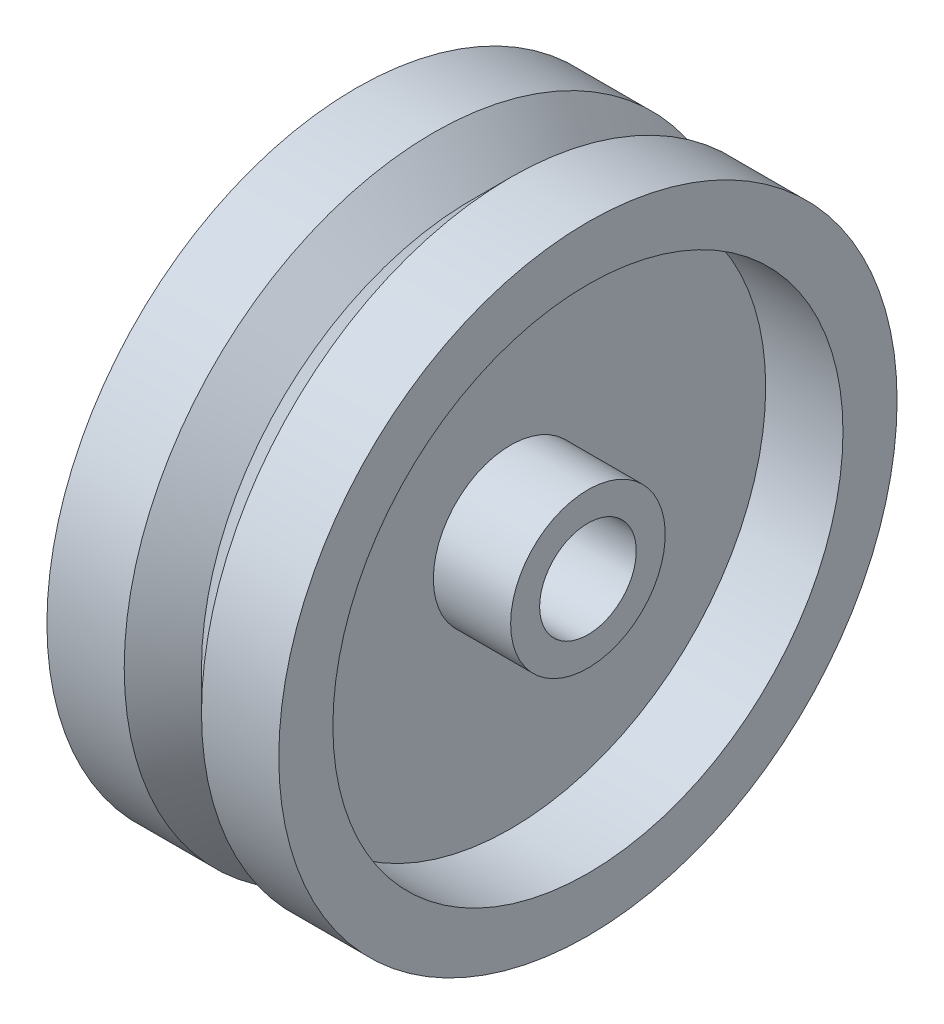
ISO-10303-21;
HEADER;
FILE_DESCRIPTION(('STEP AP214'),'2;1');
FILE_NAME('part.step','',(''),(''),'','','');
FILE_SCHEMA(('AUTOMOTIVE_DESIGN { 1 0 10303 214 1 1 1 1 }'));
ENDSEC;
DATA;
#1=APPLICATION_CONTEXT('core data for automotive mechanical design processes');
#2=APPLICATION_PROTOCOL_DEFINITION('international standard','automotive_design',2000,#1);
#3=PRODUCT_CONTEXT('',#1,'mechanical');
#4=PRODUCT('Part','Part','',(#3));
#5=PRODUCT_RELATED_PRODUCT_CATEGORY('part','',(#4));
#6=PRODUCT_DEFINITION_FORMATION('','',#4);
#7=PRODUCT_DEFINITION_CONTEXT('part definition',#1,'design');
#8=PRODUCT_DEFINITION('design','',#6,#7);
#9=PRODUCT_DEFINITION_SHAPE('','',#8);
#10=(LENGTH_UNIT() NAMED_UNIT(*) SI_UNIT(.MILLI.,.METRE.));
#11=(NAMED_UNIT(*) PLANE_ANGLE_UNIT() SI_UNIT($,.RADIAN.));
#12=(NAMED_UNIT(*) SI_UNIT($,.STERADIAN.) SOLID_ANGLE_UNIT());
#13=UNCERTAINTY_MEASURE_WITH_UNIT(LENGTH_MEASURE(1.E-05),#10,'distance_accuracy_value','');
#14=(GEOMETRIC_REPRESENTATION_CONTEXT(3) GLOBAL_UNCERTAINTY_ASSIGNED_CONTEXT((#13)) GLOBAL_UNIT_ASSIGNED_CONTEXT((#10,
#11,#12)) REPRESENTATION_CONTEXT('',''));
#15=CARTESIAN_POINT('',(0.,0.,0.));
#16=DIRECTION('',(0.,0.,1.));
#17=DIRECTION('',(1.,0.,0.));
#18=AXIS2_PLACEMENT_3D('',#15,#16,#17);
#19=CARTESIAN_POINT('',(-7.5,5.,0.));
#20=DIRECTION('',(1.,0.,0.));
#21=DIRECTION('',(0.,0.,-1.));
#22=AXIS2_PLACEMENT_3D('',#19,#20,#21);
#23=PLANE('',#22);
#24=CARTESIAN_POINT('',(-7.5,0.,0.));
#25=DIRECTION('',(-1.,0.,0.));
#26=DIRECTION('',(0.,0.,1.));
#27=AXIS2_PLACEMENT_3D('',#24,#25,#26);
#28=CIRCLE('',#27,3.125);
#29=CARTESIAN_POINT('',(-7.5,0.,3.125));
#30=VERTEX_POINT('',#29);
#31=EDGE_CURVE('E10',#30,#30,#28,.T.);
#32=ORIENTED_EDGE('',*,*,#31,.F.);
#33=EDGE_LOOP('',(#32));
#34=FACE_BOUND('',#33,.T.);
#35=CARTESIAN_POINT('',(-7.5,0.,0.));
#36=DIRECTION('',(-1.,0.,0.));
#37=DIRECTION('',(0.,0.,1.));
#38=AXIS2_PLACEMENT_3D('',#35,#36,#37);
#39=CIRCLE('',#38,5.);
#40=CARTESIAN_POINT('',(-7.5,0.,5.));
#41=VERTEX_POINT('',#40);
#42=EDGE_CURVE('E80',#41,#41,#39,.T.);
#43=ORIENTED_EDGE('',*,*,#42,.T.);
#44=EDGE_LOOP('',(#43));
#45=FACE_BOUND('',#44,.T.);
#46=ADVANCED_FACE('F31',(#34,#45),#23,.F.);
#47=CARTESIAN_POINT('',(-11.3671902715089,0.,0.));
#48=DIRECTION('',(-1.,0.,0.));
#49=DIRECTION('',(0.,0.,1.));
#50=AXIS2_PLACEMENT_3D('',#47,#48,#49);
#51=CYLINDRICAL_SURFACE('',#50,3.125);
#52=CARTESIAN_POINT('',(7.5,0.,0.));
#53=DIRECTION('',(-1.,0.,0.));
#54=DIRECTION('',(0.,0.,1.));
#55=AXIS2_PLACEMENT_3D('',#52,#53,#54);
#56=CIRCLE('',#55,3.125);
#57=CARTESIAN_POINT('',(7.5,0.,3.125));
#58=VERTEX_POINT('',#57);
#59=EDGE_CURVE('E37',#58,#58,#56,.T.);
#60=ORIENTED_EDGE('',*,*,#59,.F.);
#61=EDGE_LOOP('',(#60));
#62=FACE_BOUND('',#61,.T.);
#63=ORIENTED_EDGE('',*,*,#31,.T.);
#64=EDGE_LOOP('',(#63));
#65=FACE_BOUND('',#64,.T.);
#66=ADVANCED_FACE('F159',(#62,#65),#51,.F.);
#67=CARTESIAN_POINT('',(7.5,3.125,0.));
#68=DIRECTION('',(-1.,0.,0.));
#69=DIRECTION('',(0.,0.,1.));
#70=AXIS2_PLACEMENT_3D('',#67,#68,#69);
#71=PLANE('',#70);
#72=CARTESIAN_POINT('',(7.5,0.,0.));
#73=DIRECTION('',(-1.,0.,0.));
#74=DIRECTION('',(0.,0.,1.));
#75=AXIS2_PLACEMENT_3D('',#72,#73,#74);
#76=CIRCLE('',#75,5.);
#77=CARTESIAN_POINT('',(7.5,0.,5.));
#78=VERTEX_POINT('',#77);
#79=EDGE_CURVE('E41',#78,#78,#76,.T.);
#80=ORIENTED_EDGE('',*,*,#79,.F.);
#81=EDGE_LOOP('',(#80));
#82=FACE_BOUND('',#81,.T.);
#83=ORIENTED_EDGE('',*,*,#59,.T.);
#84=EDGE_LOOP('',(#83));
#85=FACE_BOUND('',#84,.T.);
#86=ADVANCED_FACE('F154',(#82,#85),#71,.F.);
#87=CARTESIAN_POINT('',(-11.3671902715089,0.,0.));
#88=DIRECTION('',(-1.,0.,0.));
#89=DIRECTION('',(0.,0.,1.));
#90=AXIS2_PLACEMENT_3D('',#87,#88,#89);
#91=CYLINDRICAL_SURFACE('',#90,5.);
#92=CARTESIAN_POINT('',(2.5,0.,0.));
#93=DIRECTION('',(-1.,0.,0.));
#94=DIRECTION('',(0.,0.,1.));
#95=AXIS2_PLACEMENT_3D('',#92,#93,#94);
#96=CIRCLE('',#95,5.);
#97=CARTESIAN_POINT('',(2.5,0.,5.));
#98=VERTEX_POINT('',#97);
#99=EDGE_CURVE('E45',#98,#98,#96,.T.);
#100=ORIENTED_EDGE('',*,*,#99,.F.);
#101=EDGE_LOOP('',(#100));
#102=FACE_BOUND('',#101,.T.);
#103=ORIENTED_EDGE('',*,*,#79,.T.);
#104=EDGE_LOOP('',(#103));
#105=FACE_BOUND('',#104,.T.);
#106=ADVANCED_FACE('F148',(#102,#105),#91,.T.);
#107=CARTESIAN_POINT('',(2.5,5.,0.));
#108=DIRECTION('',(-1.,0.,0.));
#109=DIRECTION('',(0.,0.,1.));
#110=AXIS2_PLACEMENT_3D('',#107,#108,#109);
#111=PLANE('',#110);
#112=CARTESIAN_POINT('',(2.5,0.,0.));
#113=DIRECTION('',(-1.,0.,0.));
#114=DIRECTION('',(0.,0.,1.));
#115=AXIS2_PLACEMENT_3D('',#112,#113,#114);
#116=CIRCLE('',#115,16.5);
#117=CARTESIAN_POINT('',(2.5,0.,16.5));
#118=VERTEX_POINT('',#117);
#119=EDGE_CURVE('E50',#118,#118,#116,.T.);
#120=ORIENTED_EDGE('',*,*,#119,.F.);
#121=EDGE_LOOP('',(#120));
#122=FACE_BOUND('',#121,.T.);
#123=ORIENTED_EDGE('',*,*,#99,.T.);
#124=EDGE_LOOP('',(#123));
#125=FACE_BOUND('',#124,.T.);
#126=ADVANCED_FACE('F142',(#122,#125),#111,.F.);
#127=CARTESIAN_POINT('',(-11.3671902715089,0.,0.));
#128=DIRECTION('',(-1.,0.,0.));
#129=DIRECTION('',(0.,0.,1.));
#130=AXIS2_PLACEMENT_3D('',#127,#128,#129);
#131=CYLINDRICAL_SURFACE('',#130,16.5);
#132=CARTESIAN_POINT('',(7.5,0.,0.));
#133=DIRECTION('',(-1.,0.,0.));
#134=DIRECTION('',(0.,0.,1.));
#135=AXIS2_PLACEMENT_3D('',#132,#133,#134);
#136=CIRCLE('',#135,16.5);
#137=CARTESIAN_POINT('',(7.5,0.,16.5));
#138=VERTEX_POINT('',#137);
#139=EDGE_CURVE('E53',#138,#138,#136,.T.);
#140=ORIENTED_EDGE('',*,*,#139,.F.);
#141=EDGE_LOOP('',(#140));
#142=FACE_BOUND('',#141,.T.);
#143=ORIENTED_EDGE('',*,*,#119,.T.);
#144=EDGE_LOOP('',(#143));
#145=FACE_BOUND('',#144,.T.);
#146=ADVANCED_FACE('F136',(#142,#145),#131,.F.);
#147=CARTESIAN_POINT('',(7.5,16.5,0.));
#148=DIRECTION('',(-1.,0.,0.));
#149=DIRECTION('',(0.,0.,1.));
#150=AXIS2_PLACEMENT_3D('',#147,#148,#149);
#151=PLANE('',#150);
#152=CARTESIAN_POINT('',(7.5,0.,0.));
#153=DIRECTION('',(-1.,0.,0.));
#154=DIRECTION('',(0.,0.,1.));
#155=AXIS2_PLACEMENT_3D('',#152,#153,#154);
#156=CIRCLE('',#155,20.);
#157=CARTESIAN_POINT('',(7.5,0.,20.));
#158=VERTEX_POINT('',#157);
#159=EDGE_CURVE('E56',#158,#158,#156,.T.);
#160=ORIENTED_EDGE('',*,*,#159,.F.);
#161=EDGE_LOOP('',(#160));
#162=FACE_BOUND('',#161,.T.);
#163=ORIENTED_EDGE('',*,*,#139,.T.);
#164=EDGE_LOOP('',(#163));
#165=FACE_BOUND('',#164,.T.);
#166=ADVANCED_FACE('F130',(#162,#165),#151,.F.);
#167=CARTESIAN_POINT('',(-11.3671902715089,0.,0.));
#168=DIRECTION('',(-1.,0.,0.));
#169=DIRECTION('',(0.,0.,1.));
#170=AXIS2_PLACEMENT_3D('',#167,#168,#169);
#171=CYLINDRICAL_SURFACE('',#170,20.);
#172=CARTESIAN_POINT('',(2.5,0.,0.));
#173=DIRECTION('',(-1.,0.,0.));
#174=DIRECTION('',(0.,0.,1.));
#175=AXIS2_PLACEMENT_3D('',#172,#173,#174);
#176=CIRCLE('',#175,20.);
#177=CARTESIAN_POINT('',(2.5,0.,20.));
#178=VERTEX_POINT('',#177);
#179=EDGE_CURVE('E59',#178,#178,#176,.T.);
#180=ORIENTED_EDGE('',*,*,#179,.F.);
#181=EDGE_LOOP('',(#180));
#182=FACE_BOUND('',#181,.T.);
#183=ORIENTED_EDGE('',*,*,#159,.T.);
#184=EDGE_LOOP('',(#183));
#185=FACE_BOUND('',#184,.T.);
#186=ADVANCED_FACE('F124',(#182,#185),#171,.T.);
#187=CARTESIAN_POINT('',(2.5,0.,0.));
#188=DIRECTION('',(1.,0.,0.));
#189=DIRECTION('',(0.,0.,-1.));
#190=AXIS2_PLACEMENT_3D('',#187,#188,#189);
#191=CONICAL_SURFACE('',#190,20.,0.785398163397449);
#192=CARTESIAN_POINT('',(0.,0.,0.));
#193=DIRECTION('',(-1.,0.,0.));
#194=DIRECTION('',(0.,0.,1.));
#195=AXIS2_PLACEMENT_3D('',#192,#193,#194);
#196=CIRCLE('',#195,17.5);
#197=CARTESIAN_POINT('',(0.,0.,17.5));
#198=VERTEX_POINT('',#197);
#199=EDGE_CURVE('E62',#198,#198,#196,.T.);
#200=ORIENTED_EDGE('',*,*,#199,.F.);
#201=EDGE_LOOP('',(#200));
#202=FACE_BOUND('',#201,.T.);
#203=ORIENTED_EDGE('',*,*,#179,.T.);
#204=EDGE_LOOP('',(#203));
#205=FACE_BOUND('',#204,.T.);
#206=ADVANCED_FACE('F118',(#202,#205),#191,.T.);
#207=CARTESIAN_POINT('',(0.,0.,0.));
#208=DIRECTION('',(-1.,0.,0.));
#209=DIRECTION('',(0.,0.,1.));
#210=AXIS2_PLACEMENT_3D('',#207,#208,#209);
#211=CONICAL_SURFACE('',#210,17.5,0.785398163397449);
#212=CARTESIAN_POINT('',(-2.5,0.,0.));
#213=DIRECTION('',(-1.,0.,0.));
#214=DIRECTION('',(0.,0.,1.));
#215=AXIS2_PLACEMENT_3D('',#212,#213,#214);
#216=CIRCLE('',#215,20.);
#217=CARTESIAN_POINT('',(-2.5,0.,20.));
#218=VERTEX_POINT('',#217);
#219=EDGE_CURVE('E65',#218,#218,#216,.T.);
#220=ORIENTED_EDGE('',*,*,#219,.F.);
#221=EDGE_LOOP('',(#220));
#222=FACE_BOUND('',#221,.T.);
#223=ORIENTED_EDGE('',*,*,#199,.T.);
#224=EDGE_LOOP('',(#223));
#225=FACE_BOUND('',#224,.T.);
#226=ADVANCED_FACE('F112',(#222,#225),#211,.T.);
#227=CARTESIAN_POINT('',(-11.3671902715089,0.,0.));
#228=DIRECTION('',(-1.,0.,0.));
#229=DIRECTION('',(0.,0.,1.));
#230=AXIS2_PLACEMENT_3D('',#227,#228,#229);
#231=CYLINDRICAL_SURFACE('',#230,20.);
#232=CARTESIAN_POINT('',(-7.5,0.,0.));
#233=DIRECTION('',(-1.,0.,0.));
#234=DIRECTION('',(0.,0.,1.));
#235=AXIS2_PLACEMENT_3D('',#232,#233,#234);
#236=CIRCLE('',#235,20.);
#237=CARTESIAN_POINT('',(-7.5,0.,20.));
#238=VERTEX_POINT('',#237);
#239=EDGE_CURVE('E68',#238,#238,#236,.T.);
#240=ORIENTED_EDGE('',*,*,#239,.F.);
#241=EDGE_LOOP('',(#240));
#242=FACE_BOUND('',#241,.T.);
#243=ORIENTED_EDGE('',*,*,#219,.T.);
#244=EDGE_LOOP('',(#243));
#245=FACE_BOUND('',#244,.T.);
#246=ADVANCED_FACE('F106',(#242,#245),#231,.T.);
#247=CARTESIAN_POINT('',(-7.5,20.,0.));
#248=DIRECTION('',(1.,0.,0.));
#249=DIRECTION('',(0.,0.,-1.));
#250=AXIS2_PLACEMENT_3D('',#247,#248,#249);
#251=PLANE('',#250);
#252=CARTESIAN_POINT('',(-7.5,0.,0.));
#253=DIRECTION('',(-1.,0.,0.));
#254=DIRECTION('',(0.,0.,1.));
#255=AXIS2_PLACEMENT_3D('',#252,#253,#254);
#256=CIRCLE('',#255,16.5);
#257=CARTESIAN_POINT('',(-7.5,0.,16.5));
#258=VERTEX_POINT('',#257);
#259=EDGE_CURVE('E71',#258,#258,#256,.T.);
#260=ORIENTED_EDGE('',*,*,#259,.F.);
#261=EDGE_LOOP('',(#260));
#262=FACE_BOUND('',#261,.T.);
#263=ORIENTED_EDGE('',*,*,#239,.T.);
#264=EDGE_LOOP('',(#263));
#265=FACE_BOUND('',#264,.T.);
#266=ADVANCED_FACE('F100',(#262,#265),#251,.F.);
#267=CARTESIAN_POINT('',(-11.3671902715089,0.,0.));
#268=DIRECTION('',(-1.,0.,0.));
#269=DIRECTION('',(0.,0.,1.));
#270=AXIS2_PLACEMENT_3D('',#267,#268,#269);
#271=CYLINDRICAL_SURFACE('',#270,16.5);
#272=CARTESIAN_POINT('',(-2.5,0.,0.));
#273=DIRECTION('',(-1.,0.,0.));
#274=DIRECTION('',(0.,0.,1.));
#275=AXIS2_PLACEMENT_3D('',#272,#273,#274);
#276=CIRCLE('',#275,16.5);
#277=CARTESIAN_POINT('',(-2.5,0.,16.5));
#278=VERTEX_POINT('',#277);
#279=EDGE_CURVE('E74',#278,#278,#276,.T.);
#280=ORIENTED_EDGE('',*,*,#279,.F.);
#281=EDGE_LOOP('',(#280));
#282=FACE_BOUND('',#281,.T.);
#283=ORIENTED_EDGE('',*,*,#259,.T.);
#284=EDGE_LOOP('',(#283));
#285=FACE_BOUND('',#284,.T.);
#286=ADVANCED_FACE('F94',(#282,#285),#271,.F.);
#287=CARTESIAN_POINT('',(-2.5,16.5,0.));
#288=DIRECTION('',(1.,0.,0.));
#289=DIRECTION('',(0.,0.,-1.));
#290=AXIS2_PLACEMENT_3D('',#287,#288,#289);
#291=PLANE('',#290);
#292=CARTESIAN_POINT('',(-2.5,0.,0.));
#293=DIRECTION('',(-1.,0.,0.));
#294=DIRECTION('',(0.,0.,1.));
#295=AXIS2_PLACEMENT_3D('',#292,#293,#294);
#296=CIRCLE('',#295,5.);
#297=CARTESIAN_POINT('',(-2.5,0.,5.));
#298=VERTEX_POINT('',#297);
#299=EDGE_CURVE('E77',#298,#298,#296,.T.);
#300=ORIENTED_EDGE('',*,*,#299,.F.);
#301=EDGE_LOOP('',(#300));
#302=FACE_BOUND('',#301,.T.);
#303=ORIENTED_EDGE('',*,*,#279,.T.);
#304=EDGE_LOOP('',(#303));
#305=FACE_BOUND('',#304,.T.);
#306=ADVANCED_FACE('F88',(#302,#305),#291,.F.);
#307=CARTESIAN_POINT('',(-11.3671902715089,0.,0.));
#308=DIRECTION('',(-1.,0.,0.));
#309=DIRECTION('',(0.,0.,1.));
#310=AXIS2_PLACEMENT_3D('',#307,#308,#309);
#311=CYLINDRICAL_SURFACE('',#310,5.);
#312=ORIENTED_EDGE('',*,*,#42,.F.);
#313=EDGE_LOOP('',(#312));
#314=FACE_BOUND('',#313,.T.);
#315=ORIENTED_EDGE('',*,*,#299,.T.);
#316=EDGE_LOOP('',(#315));
#317=FACE_BOUND('',#316,.T.);
#318=ADVANCED_FACE('F85',(#314,#317),#311,.T.);
#319=CLOSED_SHELL('',(#46,#66,#86,#106,#126,#146,#166,#186,#206,#226,#246,#266,#286,#306,#318));
#320=MANIFOLD_SOLID_BREP('B2',#319);
#321=ADVANCED_BREP_SHAPE_REPRESENTATION('',(#18,#320),#14);
#322=SHAPE_DEFINITION_REPRESENTATION(#9,#321);
ENDSEC;
END-ISO-10303-21;
